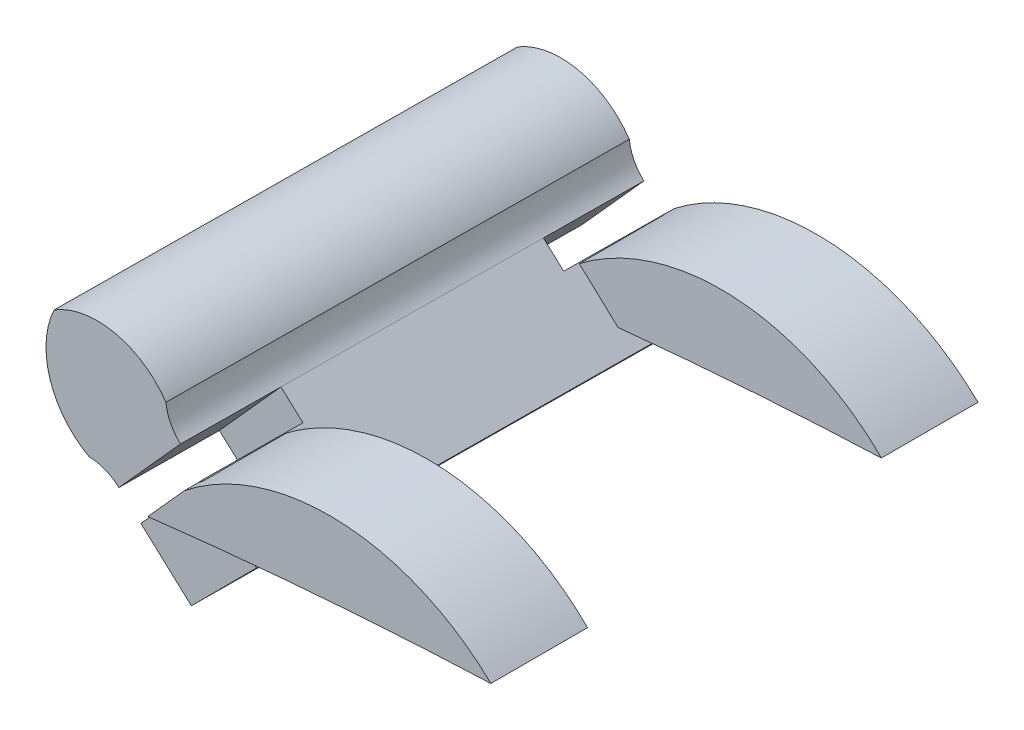
ISO-10303-21;
HEADER;
FILE_DESCRIPTION(('STEP AP214'),'2;1');
FILE_NAME('part.step','',(''),(''),'','','');
FILE_SCHEMA(('AUTOMOTIVE_DESIGN { 1 0 10303 214 1 1 1 1 }'));
ENDSEC;
DATA;
#1=APPLICATION_CONTEXT('core data for automotive mechanical design processes');
#2=APPLICATION_PROTOCOL_DEFINITION('international standard','automotive_design',2000,#1);
#3=PRODUCT_CONTEXT('',#1,'mechanical');
#4=PRODUCT('Part','Part','',(#3));
#5=PRODUCT_RELATED_PRODUCT_CATEGORY('part','',(#4));
#6=PRODUCT_DEFINITION_FORMATION('','',#4);
#7=PRODUCT_DEFINITION_CONTEXT('part definition',#1,'design');
#8=PRODUCT_DEFINITION('design','',#6,#7);
#9=PRODUCT_DEFINITION_SHAPE('','',#8);
#10=(LENGTH_UNIT() NAMED_UNIT(*) SI_UNIT(.MILLI.,.METRE.));
#11=(NAMED_UNIT(*) PLANE_ANGLE_UNIT() SI_UNIT($,.RADIAN.));
#12=(NAMED_UNIT(*) SI_UNIT($,.STERADIAN.) SOLID_ANGLE_UNIT());
#13=UNCERTAINTY_MEASURE_WITH_UNIT(LENGTH_MEASURE(1.E-05),#10,'distance_accuracy_value','');
#14=(GEOMETRIC_REPRESENTATION_CONTEXT(3) GLOBAL_UNCERTAINTY_ASSIGNED_CONTEXT((#13)) GLOBAL_UNIT_ASSIGNED_CONTEXT((#10,
#11,#12)) REPRESENTATION_CONTEXT('',''));
#15=CARTESIAN_POINT('',(0.,0.,0.));
#16=DIRECTION('',(0.,0.,1.));
#17=DIRECTION('',(1.,0.,0.));
#18=AXIS2_PLACEMENT_3D('',#15,#16,#17);
#19=CARTESIAN_POINT('',(49.7,35.27415884797,-4.10000922102E-11));
#20=DIRECTION('',(0.,0.,1.));
#21=DIRECTION('',(1.,0.,0.));
#22=AXIS2_PLACEMENT_3D('',#19,#20,#21);
#23=PLANE('',#22);
#24=CARTESIAN_POINT('',(46.2,61.50000005729,-4.09984546312359E-11));
#25=DIRECTION('',(0.,0.,1.));
#26=DIRECTION('',(1.,0.,0.));
#27=AXIS2_PLACEMENT_3D('',#24,#25,#26);
#28=CIRCLE('',#27,8.353678911594);
#29=CARTESIAN_POINT('',(40.9719558750908,68.0154820798278,-4.09764453271344E-11));
#30=VERTEX_POINT('',#29);
#31=CARTESIAN_POINT('',(51.9864069912262,67.5250681473659,-3.8772584258024E-11));
#32=VERTEX_POINT('',#31);
#33=EDGE_CURVE('E261',#30,#32,#28,.F.);
#34=ORIENTED_EDGE('',*,*,#33,.F.);
#35=DIRECTION('',(0.668223170633966,0.743960882189306,0.));
#36=VECTOR('',#35,1.);
#37=CARTESIAN_POINT('',(41.1208687099459,68.1812729845103,-4.09544360230329E-11));
#38=LINE('',#37,#36);
#39=CARTESIAN_POINT('',(39.6614822989728,66.5564768842461,-3.86675283806093E-11));
#40=VERTEX_POINT('',#39);
#41=EDGE_CURVE('E273',#30,#40,#38,.F.);
#42=ORIENTED_EDGE('',*,*,#41,.T.);
#43=CARTESIAN_POINT('',(58.3500167317,-92.34833312181,-3.63806207381856E-11));
#44=DIRECTION('',(0.,0.,1.));
#45=DIRECTION('',(1.,0.,0.));
#46=AXIS2_PLACEMENT_3D('',#43,#44,#45);
#47=CIRCLE('',#46,159.9999998822);
#48=EDGE_CURVE('E257',#40,#32,#47,.F.);
#49=ORIENTED_EDGE('',*,*,#48,.T.);
#50=EDGE_LOOP('',(#34,#42,#49));
#51=FACE_BOUND('',#50,.T.);
#52=ADVANCED_FACE('F16',(#51),#23,.T.);
#53=CARTESIAN_POINT('',(37.51144132404,69.20145831981,-0.5187039433837));
#54=DIRECTION('',(-0.00295958513391493,0.00557452525148287,0.999980082563676));
#55=DIRECTION('',(0.,-0.999984462077299,0.00557454966567842));
#56=AXIS2_PLACEMENT_3D('',#53,#54,#55);
#57=PLANE('',#56);
#58=CARTESIAN_POINT('',(58.3500167317,-92.34833312181,0.443552152042385));
#59=DIRECTION('',(-0.00295958513391493,0.00557452525148287,0.999980082563676));
#60=DIRECTION('',(0.468913388580543,-0.883221602732841,0.00631145592904762));
#61=AXIS2_PLACEMENT_3D('',#58,#59,#60);
#62=ELLIPSE('',#61,160.003186735483,159.9999998822);
#63=CARTESIAN_POINT('',(42.5741300393661,66.8720216114032,-0.490734424290321));
#64=VERTEX_POINT('',#63);
#65=CARTESIAN_POINT('',(39.6659145966319,66.5569980968447,-0.497585565399923));
#66=VERTEX_POINT('',#65);
#67=EDGE_CURVE('E195',#64,#66,#62,.T.);
#68=ORIENTED_EDGE('',*,*,#67,.T.);
#69=DIRECTION('',(-0.668231164335876,-0.743950538787235,0.00216952725328438));
#70=VECTOR('',#69,1.);
#71=CARTESIAN_POINT('',(39.6659145970363,66.5569980968643,-0.49758556539745));
#72=LINE('',#71,#70);
#73=CARTESIAN_POINT('',(38.9159635998299,65.7220677939799,-0.495150720670199));
#74=VERTEX_POINT('',#73);
#75=EDGE_CURVE('E416',#66,#74,#72,.T.);
#76=ORIENTED_EDGE('',*,*,#75,.T.);
#77=DIRECTION('',(-0.743947815282822,0.668211433985146,-0.00592685645437867));
#78=VECTOR('',#77,1.);
#79=CARTESIAN_POINT('',(40.743883799446,64.0802359978455,-0.480588112365385));
#80=LINE('',#79,#78);
#81=CARTESIAN_POINT('',(40.7438837994466,64.080235997845,-0.48058811236538));
#82=VERTEX_POINT('',#81);
#83=EDGE_CURVE('E190',#82,#74,#80,.T.);
#84=ORIENTED_EDGE('',*,*,#83,.F.);
#85=DIRECTION('',(-0.706250597059794,-0.707959496056707,0.00185636629396158));
#86=VECTOR('',#85,1.);
#87=CARTESIAN_POINT('',(43.0777091963512,66.4197085005988,-0.48672252813909));
#88=LINE('',#87,#86);
#89=CARTESIAN_POINT('',(43.0777091963491,66.4197085005982,-0.486722528139106));
#90=VERTEX_POINT('',#89);
#91=EDGE_CURVE('E187',#90,#82,#88,.T.);
#92=ORIENTED_EDGE('',*,*,#91,.F.);
#93=DIRECTION('',(-0.743947815290676,0.668211433976401,-0.00592685645435976));
#94=VECTOR('',#93,1.);
#95=CARTESIAN_POINT('',(43.07770919635,66.4197085006,-0.486722528139127));
#96=LINE('',#95,#94);
#97=EDGE_CURVE('E173',#90,#64,#96,.T.);
#98=ORIENTED_EDGE('',*,*,#97,.T.);
#99=EDGE_LOOP('',(#68,#76,#84,#92,#98));
#100=FACE_BOUND('',#99,.T.);
#101=ADVANCED_FACE('F188',(#100),#57,.T.);
#102=CARTESIAN_POINT('',(0.04985109407037,-0.09389700587586,-16.84361115115));
#103=DIRECTION('',(0.00295958513391493,-0.00557452525148286,-0.999980082563676));
#104=DIRECTION('',(0.,0.999984462077299,-0.00557454966567841));
#105=AXIS2_PLACEMENT_3D('',#102,#103,#104);
#106=PLANE('',#105);
#107=DIRECTION('',(0.743947815282821,-0.668211433985151,0.00592685645390303));
#108=VECTOR('',#107,1.);
#109=CARTESIAN_POINT('',(38.9055768878271,65.6829875895268,-17.09529423974));
#110=LINE('',#109,#108);
#111=CARTESIAN_POINT('',(38.9055768878314,65.6829875895268,-17.095294239742));
#112=VERTEX_POINT('',#111);
#113=CARTESIAN_POINT('',(40.7930129126705,63.9876988786695,-17.0802574829206));
#114=VERTEX_POINT('',#113);
#115=EDGE_CURVE('E426',#112,#114,#110,.T.);
#116=ORIENTED_EDGE('',*,*,#115,.F.);
#117=DIRECTION('',(0.668231164335149,0.743950538787881,-0.00216952725576038));
#118=VECTOR('',#117,1.);
#119=CARTESIAN_POINT('',(38.90557688783,65.68298758953,-17.0952942397462));
#120=LINE('',#119,#118);
#121=CARTESIAN_POINT('',(39.6935466075887,66.560244635364,-17.097852518786));
#122=VERTEX_POINT('',#121);
#123=EDGE_CURVE('E428',#112,#122,#120,.T.);
#124=ORIENTED_EDGE('',*,*,#123,.T.);
#125=CARTESIAN_POINT('',(58.3500167317,-92.34833312181,-16.1567784839886));
#126=DIRECTION('',(0.00295958513391493,-0.00557452525148286,-0.999980082563676));
#127=DIRECTION('',(0.468913388580543,-0.883221602732841,0.00631145592904762));
#128=AXIS2_PLACEMENT_3D('',#125,#126,#127);
#129=ELLIPSE('',#128,160.003186735483,159.9999998822);
#130=CARTESIAN_POINT('',(42.5255959213381,66.867205279179,-17.0911818547361));
#131=VERTEX_POINT('',#130);
#132=EDGE_CURVE('E251',#122,#131,#129,.T.);
#133=ORIENTED_EDGE('',*,*,#132,.T.);
#134=DIRECTION('',(0.743947815279004,-0.668211433989397,0.00592685645440019));
#135=VECTOR('',#134,1.);
#136=CARTESIAN_POINT('',(42.52559592135,66.86720527917,-17.0911818547361));
#137=LINE('',#136,#135);
#138=CARTESIAN_POINT('',(43.1268383095701,66.3271713814201,-17.0863918986993));
#139=VERTEX_POINT('',#138);
#140=EDGE_CURVE('E167',#131,#139,#137,.T.);
#141=ORIENTED_EDGE('',*,*,#140,.T.);
#142=DIRECTION('',(0.706250597059797,0.7079594960567,-0.0018563662958682));
#143=VECTOR('',#142,1.);
#144=CARTESIAN_POINT('',(40.7930129126711,63.987698878669,-17.08025748292));
#145=LINE('',#144,#143);
#146=EDGE_CURVE('E198',#114,#139,#145,.T.);
#147=ORIENTED_EDGE('',*,*,#146,.F.);
#148=EDGE_LOOP('',(#116,#124,#133,#141,#147));
#149=FACE_BOUND('',#148,.T.);
#150=ADVANCED_FACE('F306',(#149),#106,.T.);
#151=CARTESIAN_POINT('',(0.,0.,-17.50000000004));
#152=DIRECTION('',(0.,0.,-1.));
#153=DIRECTION('',(-1.,0.,0.));
#154=AXIS2_PLACEMENT_3D('',#151,#152,#153);
#155=PLANE('',#154);
#156=CARTESIAN_POINT('',(58.3500167317,-92.34833312181,-17.50000000004));
#157=DIRECTION('',(0.,0.,1.));
#158=DIRECTION('',(1.,0.,0.));
#159=AXIS2_PLACEMENT_3D('',#156,#157,#158);
#160=CIRCLE('',#159,159.9999998822);
#161=CARTESIAN_POINT('',(51.9864069912267,67.5250681473527,-17.50000000004));
#162=VERTEX_POINT('',#161);
#163=CARTESIAN_POINT('',(39.6971280538405,66.5606650698306,-17.50000000004));
#164=VERTEX_POINT('',#163);
#165=EDGE_CURVE('E249',#162,#164,#160,.T.);
#166=ORIENTED_EDGE('',*,*,#165,.T.);
#167=DIRECTION('',(0.668223170633966,0.743960882189306,0.));
#168=VECTOR('',#167,1.);
#169=CARTESIAN_POINT('',(41.1177117953848,68.1422605307908,-17.50000000004));
#170=LINE('',#169,#168);
#171=CARTESIAN_POINT('',(41.0813296543652,68.1017547672699,-17.50000000004));
#172=VERTEX_POINT('',#171);
#173=EDGE_CURVE('E240',#164,#172,#170,.T.);
#174=ORIENTED_EDGE('',*,*,#173,.T.);
#175=CARTESIAN_POINT('',(46.2,61.50000005729,-17.50000000004));
#176=DIRECTION('',(0.,0.,1.));
#177=DIRECTION('',(1.,0.,0.));
#178=AXIS2_PLACEMENT_3D('',#175,#176,#177);
#179=CIRCLE('',#178,8.353678911594);
#180=EDGE_CURVE('E241',#162,#172,#179,.T.);
#181=ORIENTED_EDGE('',*,*,#180,.F.);
#182=EDGE_LOOP('',(#166,#174,#181));
#183=FACE_BOUND('',#182,.T.);
#184=ADVANCED_FACE('F302',(#183),#155,.T.);
#185=CARTESIAN_POINT('',(40.79301291267,63.98769887867,-17.08025748292));
#186=DIRECTION('',(-0.668231164337429,-0.743950538785832,0.00216952725574509));
#187=DIRECTION('',(0.743952289623257,-0.668232736974412,0.));
#188=AXIS2_PLACEMENT_3D('',#185,#186,#187);
#189=PLANE('',#188);
#190=DIRECTION('',(0.00295958513439648,-0.0055745252509481,-0.999980082563677));
#191=VECTOR('',#190,1.);
#192=CARTESIAN_POINT('',(38.91596359983,65.72206779398,-0.495150720670201));
#193=LINE('',#192,#191);
#194=CARTESIAN_POINT('',(38.9266181063125,65.7019995030777,-4.09507901789898));
#195=VERTEX_POINT('',#194);
#196=EDGE_CURVE('E275',#74,#195,#193,.T.);
#197=ORIENTED_EDGE('',*,*,#196,.T.);
#198=DIRECTION('',(-0.743947815287817,0.668211433979585,-0.00592685645436911));
#199=VECTOR('',#198,1.);
#200=CARTESIAN_POINT('',(38.92661810631,65.70199950308,-4.09507901789899));
#201=LINE('',#200,#199);
#202=CARTESIAN_POINT('',(38.1305939439536,66.4169857374386,-4.10142075430578));
#203=VERTEX_POINT('',#202);
#204=EDGE_CURVE('E412',#195,#203,#201,.T.);
#205=ORIENTED_EDGE('',*,*,#204,.T.);
#206=DIRECTION('',(-0.00295958513391512,0.00557452525148287,0.999980082563676));
#207=VECTOR('',#206,1.);
#208=CARTESIAN_POINT('',(38.1690685506945,66.3445169091747,-17.1011618276296));
#209=LINE('',#208,#207);
#210=CARTESIAN_POINT('',(38.1584140442147,66.3645852000763,-13.5012335304015));
#211=VERTEX_POINT('',#210);
#212=EDGE_CURVE('E236',#203,#211,#209,.F.);
#213=ORIENTED_EDGE('',*,*,#212,.T.);
#214=DIRECTION('',(0.743947815284975,-0.668211433982749,0.00592685645437895));
#215=VECTOR('',#214,1.);
#216=CARTESIAN_POINT('',(38.15841404421,66.36458520008,-13.501233530406));
#217=LINE('',#216,#215);
#218=CARTESIAN_POINT('',(38.8949223813499,65.70305588043,-13.4953659425161));
#219=VERTEX_POINT('',#218);
#220=EDGE_CURVE('E436',#211,#219,#217,.T.);
#221=ORIENTED_EDGE('',*,*,#220,.T.);
#222=DIRECTION('',(0.00295958513439549,-0.0055745252509501,-0.999980082563677));
#223=VECTOR('',#222,1.);
#224=CARTESIAN_POINT('',(38.8949223813498,65.7030558804302,-13.49536594251));
#225=LINE('',#224,#223);
#226=EDGE_CURVE('E419',#219,#112,#225,.T.);
#227=ORIENTED_EDGE('',*,*,#226,.T.);
#228=ORIENTED_EDGE('',*,*,#115,.T.);
#229=DIRECTION('',(0.00295958513366292,-0.00557452525173631,-0.999980082563675));
#230=VECTOR('',#229,1.);
#231=CARTESIAN_POINT('',(40.7438837994523,64.0802359978478,-0.480588112365381));
#232=LINE('',#231,#230);
#233=EDGE_CURVE('E194',#82,#114,#232,.T.);
#234=ORIENTED_EDGE('',*,*,#233,.F.);
#235=ORIENTED_EDGE('',*,*,#83,.T.);
#236=EDGE_LOOP('',(#197,#205,#213,#221,#227,#228,#234,#235));
#237=FACE_BOUND('',#236,.T.);
#238=ADVANCED_FACE('F298',(#237),#189,.T.);
#239=CARTESIAN_POINT('',(41.13178094862,68.15703628108,-4.102238457843));
#240=DIRECTION('',(0.00295958513391493,-0.00557452525148286,-0.999980082563676));
#241=DIRECTION('',(0.,0.999984462077299,-0.00557454966567841));
#242=AXIS2_PLACEMENT_3D('',#239,#240,#241);
#243=PLANE('',#242);
#244=ORIENTED_EDGE('',*,*,#204,.F.);
#245=DIRECTION('',(0.668231164335885,0.74395053878722,-0.00216952725575535));
#246=VECTOR('',#245,1.);
#247=CARTESIAN_POINT('',(38.9266181063138,65.7019995030766,-4.09507901789897));
#248=LINE('',#247,#246);
#249=CARTESIAN_POINT('',(41.1317809486209,68.1570362810783,-4.10223845784299));
#250=VERTEX_POINT('',#249);
#251=EDGE_CURVE('E405',#195,#250,#248,.T.);
#252=ORIENTED_EDGE('',*,*,#251,.T.);
#253=DIRECTION('',(0.743947815283635,-0.668211433984241,0.00592685645438273));
#254=VECTOR('',#253,1.);
#255=CARTESIAN_POINT('',(40.33575678627,68.87202251544,-4.10858019424916));
#256=LINE('',#255,#254);
#257=CARTESIAN_POINT('',(40.3357567862711,68.8720225154394,-4.10858019424978));
#258=VERTEX_POINT('',#257);
#259=EDGE_CURVE('E410',#258,#250,#256,.T.);
#260=ORIENTED_EDGE('',*,*,#259,.F.);
#261=DIRECTION('',(-0.668231164335884,-0.743950538787221,0.00216952725576434));
#262=VECTOR('',#261,1.);
#263=CARTESIAN_POINT('',(40.33575678627,68.87202251544,-4.10858019425));
#264=LINE('',#263,#262);
#265=EDGE_CURVE('E233',#258,#203,#264,.T.);
#266=ORIENTED_EDGE('',*,*,#265,.T.);
#267=EDGE_LOOP('',(#244,#252,#260,#266));
#268=FACE_BOUND('',#267,.T.);
#269=ADVANCED_FACE('F295',(#268),#243,.F.);
#270=CARTESIAN_POINT('',(41.11713100221,68.18463018107,0.8476629508467));
#271=DIRECTION('',(0.743947815284206,-0.668211433983605,0.00592685645438105));
#272=DIRECTION('',(0.668223170633966,0.743960882189306,0.));
#273=AXIS2_PLACEMENT_3D('',#270,#271,#272);
#274=PLANE('',#273);
#275=CARTESIAN_POINT('',(40.9861900524217,68.0268781156379,-0.5018720664473));
#276=CARTESIAN_POINT('',(40.98559644371,68.0264039282886,-0.480960730347062));
#277=CARTESIAN_POINT('',(40.9850028996882,68.0259296599577,-0.460049394246824));
#278=CARTESIAN_POINT('',(40.9838159410683,68.024980961368,-0.41822672204635));
#279=CARTESIAN_POINT('',(40.9832225264703,68.0245065311092,-0.397315385946114));
#280=CARTESIAN_POINT('',(40.9820358267423,68.0235575086991,-0.35549271374564));
#281=CARTESIAN_POINT('',(40.9814425416123,68.0230829165477,-0.334581377645403));
#282=CARTESIAN_POINT('',(40.9802561008646,68.0221335703878,-0.292758705444928));
#283=CARTESIAN_POINT('',(40.9796629452468,68.0216588163792,-0.27184736934469));
#284=CARTESIAN_POINT('',(40.9784767635675,68.0207091465403,-0.230024697144216));
#285=CARTESIAN_POINT('',(40.977883737506,68.0202342307098,-0.20911336104398));
#286=CARTESIAN_POINT('',(40.9766978149836,68.0192842372624,-0.167290688843506));
#287=CARTESIAN_POINT('',(40.9761049185226,68.0188091596454,-0.146379352743268));
#288=CARTESIAN_POINT('',(40.9749192552453,68.0178588426603,-0.104556680542794));
#289=CARTESIAN_POINT('',(40.974326488429,68.0173836032922,-0.0836453444425581));
#290=CARTESIAN_POINT('',(40.973141084485,68.0164329628402,-0.0418226722420842));
#291=CARTESIAN_POINT('',(40.9725484473574,68.0159575617563,-0.0209113361418468));
#292=CARTESIAN_POINT('',(40.9719558750963,68.0154820798322,-4.16090772947797E-11));
#293=B_SPLINE_CURVE_WITH_KNOTS('',3,(#275,#276,#277,#278,#279,#280,#281,#282,#283,#284,#285,
#286,#287,#288,#289,#290,#291,#292),.UNSPECIFIED.,.F.,.F.,(4,2,2,2,2,2,2,2,4),(0.,
0.0627753998150959,0.125550799630189,0.188326199445284,0.25110159926038,0.313876999075473,
0.376652398890568,0.439427798705661,0.502203198520757),.UNSPECIFIED.);
#294=CARTESIAN_POINT('',(40.9861900524154,68.0268781156329,-0.501872066447243));
#295=VERTEX_POINT('',#294);
#296=EDGE_CURVE('E263',#295,#30,#293,.T.);
#297=ORIENTED_EDGE('',*,*,#296,.F.);
#298=DIRECTION('',(-0.668231164336186,-0.743950538786949,0.00216952725575523));
#299=VECTOR('',#298,1.);
#300=CARTESIAN_POINT('',(41.12112644214,68.17710457198,-0.502310160614203));
#301=LINE('',#300,#299);
#302=CARTESIAN_POINT('',(41.121126442141,68.1771045719812,-0.502310160614204));
#303=VERTEX_POINT('',#302);
#304=EDGE_CURVE('E141',#303,#295,#301,.T.);
#305=ORIENTED_EDGE('',*,*,#304,.F.);
#306=DIRECTION('',(-0.00295958513285643,0.00557452525053563,0.999980082563684));
#307=VECTOR('',#306,1.);
#308=CARTESIAN_POINT('',(41.1317809486193,68.1570362810792,-4.10223845784299));
#309=LINE('',#308,#307);
#310=EDGE_CURVE('E394',#250,#303,#309,.T.);
#311=ORIENTED_EDGE('',*,*,#310,.F.);
#312=ORIENTED_EDGE('',*,*,#251,.F.);
#313=ORIENTED_EDGE('',*,*,#196,.F.);
#314=ORIENTED_EDGE('',*,*,#75,.F.);
#315=CARTESIAN_POINT('',(39.6659145970275,66.5569980968912,-0.497585565397501));
#316=CARTESIAN_POINT('',(39.6657299176384,66.5569763822732,-0.476852833507455));
#317=CARTESIAN_POINT('',(39.6655452382871,66.5569546673332,-0.456120101617409));
#318=CARTESIAN_POINT('',(39.6651758796603,66.5569112368094,-0.414654637837315));
#319=CARTESIAN_POINT('',(39.6649912003847,66.5568895212255,-0.393921905947267));
#320=CARTESIAN_POINT('',(39.6646218419093,66.5568460894138,-0.352456442167173));
#321=CARTESIAN_POINT('',(39.6644371627094,66.5568243731861,-0.331723710277127));
#322=CARTESIAN_POINT('',(39.6640678043855,66.5567809400866,-0.290258246497034));
#323=CARTESIAN_POINT('',(39.6638831252613,66.556759223215,-0.269525514606987));
#324=CARTESIAN_POINT('',(39.6635137670888,66.5567157888277,-0.228060050826895));
#325=CARTESIAN_POINT('',(39.6633290880404,66.5566940713121,-0.207327318936848));
#326=CARTESIAN_POINT('',(39.6629597300193,66.5566506356371,-0.165861855156755));
#327=CARTESIAN_POINT('',(39.6627750510466,66.5566289174776,-0.145129123266709));
#328=CARTESIAN_POINT('',(39.6624056931769,66.5565854805147,-0.103663659486615));
#329=CARTESIAN_POINT('',(39.6622210142799,66.5565637617114,-0.0829309275965675));
#330=CARTESIAN_POINT('',(39.6618516565618,66.5565203234607,-0.0414654638164734));
#331=CARTESIAN_POINT('',(39.6616669777405,66.5564986040135,-0.0207327319264269));
#332=CARTESIAN_POINT('',(39.6614822989571,66.5564768842442,-3.63806207381856E-11));
#333=B_SPLINE_CURVE_WITH_KNOTS('',3,(#315,#316,#317,#318,#319,#320,#321,#322,#323,#324,#325,
#326,#327,#328,#329,#330,#331,#332),.UNSPECIFIED.,.F.,.F.,(4,2,2,2,2,2,2,2,4),(0.,
0.0622006973162967,0.124401394632597,0.186602091948894,0.24880278926519,0.311003486581487,
0.373204183897785,0.435404881214085,0.497605578530381),.UNSPECIFIED.);
#334=EDGE_CURVE('E259',#66,#40,#333,.T.);
#335=ORIENTED_EDGE('',*,*,#334,.T.);
#336=ORIENTED_EDGE('',*,*,#41,.F.);
#337=EDGE_LOOP('',(#297,#305,#311,#312,#313,#314,#335,#336));
#338=FACE_BOUND('',#337,.T.);
#339=ADVANCED_FACE('F292',(#338),#274,.F.);
#340=CARTESIAN_POINT('',(37.51144132404,69.20145831981,-0.5187039433837));
#341=DIRECTION('',(-0.00295958513391493,0.00557452525148287,0.999980082563676));
#342=DIRECTION('',(0.,-0.999984462077299,0.00557454966567842));
#343=AXIS2_PLACEMENT_3D('',#340,#341,#342);
#344=PLANE('',#343);
#345=DIRECTION('',(0.743947815284177,-0.66821143398372,0.00592685644512403));
#346=VECTOR('',#345,1.);
#347=CARTESIAN_POINT('',(41.121126442141,68.1771045719812,-0.502310160614201));
#348=LINE('',#347,#346);
#349=CARTESIAN_POINT('',(41.1480326249479,68.1529375287733,-0.502095805413869));
#350=VERTEX_POINT('',#349);
#351=EDGE_CURVE('E391',#303,#350,#348,.T.);
#352=ORIENTED_EDGE('',*,*,#351,.F.);
#353=ORIENTED_EDGE('',*,*,#304,.T.);
#354=CARTESIAN_POINT('',(46.2,61.50000005729,-0.450056073443943));
#355=DIRECTION('',(-0.00295958513391493,0.00557452525148287,0.999980082563676));
#356=DIRECTION('',(0.468913388580543,-0.883221602732841,0.00631145592904762));
#357=AXIS2_PLACEMENT_3D('',#354,#355,#356);
#358=ELLIPSE('',#357,8.3538452987758,8.353678911594);
#359=EDGE_CURVE('E19',#350,#295,#358,.T.);
#360=ORIENTED_EDGE('',*,*,#359,.F.);
#361=EDGE_LOOP('',(#352,#353,#360));
#362=FACE_BOUND('',#361,.T.);
#363=ADVANCED_FACE('F288',(#362),#344,.T.);
#364=CARTESIAN_POINT('',(46.2,61.50000005729,-17.50000000004));
#365=DIRECTION('',(0.,0.,1.));
#366=DIRECTION('',(1.,0.,0.));
#367=AXIS2_PLACEMENT_3D('',#364,#365,#366);
#368=CYLINDRICAL_SURFACE('',#367,8.353678911594);
#369=ORIENTED_EDGE('',*,*,#296,.T.);
#370=ORIENTED_EDGE('',*,*,#33,.T.);
#371=DIRECTION('',(0.,0.,1.));
#372=VECTOR('',#371,1.);
#373=CARTESIAN_POINT('',(51.986406991239,67.5250681473665,-17.50000000004));
#374=LINE('',#373,#372);
#375=CARTESIAN_POINT('',(51.9864069912263,67.5250681473659,-3.47236209997314));
#376=VERTEX_POINT('',#375);
#377=EDGE_CURVE('E256',#32,#376,#374,.F.);
#378=ORIENTED_EDGE('',*,*,#377,.T.);
#379=CARTESIAN_POINT('',(46.2,61.50000005729,-3.36719414526751));
#380=DIRECTION('',(0.,0.01745240643669,0.999847695156402));
#381=DIRECTION('',(0.,-0.999847695156402,0.01745240643669));
#382=AXIS2_PLACEMENT_3D('',#379,#380,#381);
#383=ELLIPSE('',#382,8.35495141116195,8.353678911594);
#384=CARTESIAN_POINT('',(41.1427897587915,68.1489530526302,-3.48325205150099));
#385=VERTEX_POINT('',#384);
#386=EDGE_CURVE('E260',#376,#385,#383,.T.);
#387=ORIENTED_EDGE('',*,*,#386,.T.);
#388=DIRECTION('',(-0.00175866440114728,-0.00133655068530088,-0.999997560362919));
#389=VECTOR('',#388,1.);
#390=CARTESIAN_POINT('',(41.1480326249457,68.1529375287752,-0.502095805413886));
#391=LINE('',#390,#389);
#392=EDGE_CURVE('E387',#350,#385,#391,.T.);
#393=ORIENTED_EDGE('',*,*,#392,.F.);
#394=ORIENTED_EDGE('',*,*,#359,.T.);
#395=EDGE_LOOP('',(#369,#370,#378,#387,#393,#394));
#396=FACE_BOUND('',#395,.T.);
#397=ADVANCED_FACE('F277',(#396),#368,.T.);
#398=CARTESIAN_POINT('',(39.04910432464,40.69131666049,-3.003977225518));
#399=DIRECTION('',(0.,0.01745240643669,0.999847695156402));
#400=DIRECTION('',(0.,-0.999847695156402,0.01745240643669));
#401=AXIS2_PLACEMENT_3D('',#398,#399,#400);
#402=PLANE('',#401);
#403=CARTESIAN_POINT('',(58.3500167317,-92.34833312181,-0.681761500619618));
#404=DIRECTION('',(0.,0.01745240643669,0.999847695156402));
#405=DIRECTION('',(0.,-0.999847695156402,0.01745240643669));
#406=AXIS2_PLACEMENT_3D('',#403,#404,#405);
#407=ELLIPSE('',#406,160.024372369206,159.9999998822);
#408=CARTESIAN_POINT('',(42.5654450344582,66.8711608437041,-3.46094810553122));
#409=VERTEX_POINT('',#408);
#410=EDGE_CURVE('E254',#376,#409,#407,.T.);
#411=ORIENTED_EDGE('',*,*,#410,.T.);
#412=DIRECTION('',(0.743918598412862,-0.668168463144887,0.0116629239062376));
#413=VECTOR('',#412,1.);
#414=CARTESIAN_POINT('',(41.1427897587908,68.1489530526309,-3.483252051501));
#415=LINE('',#414,#413);
#416=EDGE_CURVE('E204',#385,#409,#415,.T.);
#417=ORIENTED_EDGE('',*,*,#416,.F.);
#418=ORIENTED_EDGE('',*,*,#386,.F.);
#419=EDGE_LOOP('',(#411,#417,#418));
#420=FACE_BOUND('',#419,.T.);
#421=ADVANCED_FACE('F287',(#420),#402,.F.);
#422=CARTESIAN_POINT('',(58.3500167317,-92.34833312181,-17.50000000004));
#423=DIRECTION('',(0.,0.,1.));
#424=DIRECTION('',(1.,0.,0.));
#425=AXIS2_PLACEMENT_3D('',#422,#423,#424);
#426=CYLINDRICAL_SURFACE('',#425,159.9999998822);
#427=DIRECTION('',(0.002924021080285,0.000289798673099883,0.999995683049407));
#428=VECTOR('',#427,1.);
#429=CARTESIAN_POINT('',(42.5654450344718,66.871160843692,-3.460948105516));
#430=LINE('',#429,#428);
#431=EDGE_CURVE('E181',#409,#64,#430,.T.);
#432=ORIENTED_EDGE('',*,*,#431,.F.);
#433=ORIENTED_EDGE('',*,*,#410,.F.);
#434=ORIENTED_EDGE('',*,*,#377,.F.);
#435=ORIENTED_EDGE('',*,*,#48,.F.);
#436=ORIENTED_EDGE('',*,*,#334,.F.);
#437=ORIENTED_EDGE('',*,*,#67,.F.);
#438=EDGE_LOOP('',(#432,#433,#434,#435,#436,#437));
#439=FACE_BOUND('',#438,.T.);
#440=ADVANCED_FACE('F448',(#439),#426,.F.);
#441=CARTESIAN_POINT('',(43.12683830957,66.32717138142,-17.0863918987));
#442=DIRECTION('',(0.707955743679309,-0.706231036284409,0.00603227818712808));
#443=DIRECTION('',(0.706243885936796,0.707968624712207,0.));
#444=AXIS2_PLACEMENT_3D('',#441,#442,#443);
#445=PLANE('',#444);
#446=ORIENTED_EDGE('',*,*,#233,.T.);
#447=ORIENTED_EDGE('',*,*,#146,.T.);
#448=DIRECTION('',(0.00295958513397572,-0.00557452525153773,-0.999980082563675));
#449=VECTOR('',#448,1.);
#450=CARTESIAN_POINT('',(43.077709196347,66.4197085005966,-0.486722528139086));
#451=LINE('',#450,#449);
#452=EDGE_CURVE('E178',#90,#139,#451,.T.);
#453=ORIENTED_EDGE('',*,*,#452,.F.);
#454=ORIENTED_EDGE('',*,*,#91,.T.);
#455=EDGE_LOOP('',(#446,#447,#453,#454));
#456=FACE_BOUND('',#455,.T.);
#457=ADVANCED_FACE('F197',(#456),#445,.T.);
#458=CARTESIAN_POINT('',(58.3500167317,-92.34833312181,-17.50000000004));
#459=DIRECTION('',(0.,0.,1.));
#460=DIRECTION('',(1.,0.,0.));
#461=AXIS2_PLACEMENT_3D('',#458,#459,#460);
#462=CYLINDRICAL_SURFACE('',#461,159.9999998822);
#463=DIRECTION('',(0.,0.,1.));
#464=VECTOR('',#463,1.);
#465=CARTESIAN_POINT('',(51.98640699124,67.52506814734,-17.50000000004));
#466=LINE('',#465,#464);
#467=CARTESIAN_POINT('',(51.9864069912395,67.5250681473532,-14.02969348663));
#468=VERTEX_POINT('',#467);
#469=EDGE_CURVE('E244',#468,#162,#466,.F.);
#470=ORIENTED_EDGE('',*,*,#469,.F.);
#471=CARTESIAN_POINT('',(42.5345790797371,66.8680978587294,-14.01822602759));
#472=CARTESIAN_POINT('',(42.9277153468179,66.9071492725742,-14.0189076677633));
#473=CARTESIAN_POINT('',(43.3209963008156,66.9447445396772,-14.0195638848228));
#474=CARTESIAN_POINT('',(44.1077584623674,67.0170146387771,-14.0208253382385));
#475=CARTESIAN_POINT('',(44.5012396239669,67.0516899709043,-14.0214305833251));
#476=CARTESIAN_POINT('',(45.2883804843133,67.1181197629246,-14.022590092797));
#477=CARTESIAN_POINT('',(45.6820401408228,67.1498747231463,-14.0231443659148));
#478=CARTESIAN_POINT('',(46.469516279359,67.2104635388224,-14.0242019314458));
#479=CARTESIAN_POINT('',(46.863332722866,67.2392978947687,-14.0247052325937));
#480=CARTESIAN_POINT('',(47.6511007347989,67.2940454183667,-14.025660854183));
#481=CARTESIAN_POINT('',(48.045052268422,67.3199590866483,-14.0261131833614));
#482=CARTESIAN_POINT('',(48.8330687706891,67.3688653186721,-14.0269668610091));
#483=CARTESIAN_POINT('',(49.2271337082466,67.3918583831533,-14.0273682182176));
#484=CARTESIAN_POINT('',(50.0153553414243,67.4349236399596,-14.0281199519244));
#485=CARTESIAN_POINT('',(50.4095120096733,67.4549963331073,-14.028470337164));
#486=CARTESIAN_POINT('',(51.1978954387375,67.4922212834076,-14.029120126927));
#487=CARTESIAN_POINT('',(51.592122175896,67.5093740414315,-14.0294195401937));
#488=CARTESIAN_POINT('',(51.986406991239,67.5250681473665,-14.02969348663));
#489=B_SPLINE_CURVE_WITH_KNOTS('',3,(#471,#472,#473,#474,#475,#476,#477,#478,#479,#480,#481,
#482,#483,#484,#485,#486,#487,#488),.UNSPECIFIED.,.F.,.F.,(4,2,2,2,2,2,2,2,4),(0.,
1.18521221332307,2.3702210073488,3.55502640172904,4.73962841612567,5.9240270702107,
7.10822238366643,8.292214376185,9.476003067469),.UNSPECIFIED.);
#490=CARTESIAN_POINT('',(42.5345790797403,66.8680978587167,-14.01822602759));
#491=VERTEX_POINT('',#490);
#492=EDGE_CURVE('E248',#468,#491,#489,.F.);
#493=ORIENTED_EDGE('',*,*,#492,.T.);
#494=DIRECTION('',(0.00292328303426323,0.000290461606445106,0.999995685014869));
#495=VECTOR('',#494,1.);
#496=CARTESIAN_POINT('',(42.5255959213468,66.8672052791664,-17.09118185474));
#497=LINE('',#496,#495);
#498=EDGE_CURVE('E199',#131,#491,#497,.T.);
#499=ORIENTED_EDGE('',*,*,#498,.F.);
#500=ORIENTED_EDGE('',*,*,#132,.F.);
#501=DIRECTION('',(0.00890544648820696,0.00104543148060944,-0.999959799239882));
#502=VECTOR('',#501,1.);
#503=CARTESIAN_POINT('',(39.6935466069744,66.560244635276,-17.09785251878));
#504=LINE('',#503,#502);
#505=EDGE_CURVE('E422',#122,#164,#504,.T.);
#506=ORIENTED_EDGE('',*,*,#505,.T.);
#507=ORIENTED_EDGE('',*,*,#165,.F.);
#508=EDGE_LOOP('',(#470,#493,#499,#500,#506,#507));
#509=FACE_BOUND('',#508,.T.);
#510=ADVANCED_FACE('F371',(#509),#462,.F.);
#511=CARTESIAN_POINT('',(52.3975813812,40.50709388454,-13.55809299166));
#512=DIRECTION('',(0.,-0.01745240643669,-0.999847695156402));
#513=DIRECTION('',(0.,0.999847695156402,-0.01745240643669));
#514=AXIS2_PLACEMENT_3D('',#511,#512,#513);
#515=PLANE('',#514);
#516=CARTESIAN_POINT('',(46.2,61.50000005729,-13.9245255319249));
#517=DIRECTION('',(0.,-0.01745240643669,-0.999847695156402));
#518=DIRECTION('',(0.,-0.999847695156402,0.01745240643669));
#519=AXIS2_PLACEMENT_3D('',#516,#517,#518);
#520=ELLIPSE('',#519,8.35495141116195,8.353678911594);
#521=CARTESIAN_POINT('',(41.1242549418551,68.1348145582991,-14.04033664982));
#522=VERTEX_POINT('',#521);
#523=EDGE_CURVE('E245',#522,#468,#520,.T.);
#524=ORIENTED_EDGE('',*,*,#523,.F.);
#525=DIRECTION('',(-0.743918598412876,0.66816846314492,-0.0116629239034107));
#526=VECTOR('',#525,1.);
#527=CARTESIAN_POINT('',(42.5345790797435,66.8680978587039,-14.01822602759));
#528=LINE('',#527,#526);
#529=EDGE_CURVE('E202',#491,#522,#528,.T.);
#530=ORIENTED_EDGE('',*,*,#529,.F.);
#531=ORIENTED_EDGE('',*,*,#492,.F.);
#532=EDGE_LOOP('',(#524,#530,#531));
#533=FACE_BOUND('',#532,.T.);
#534=ADVANCED_FACE('F367',(#533),#515,.F.);
#535=CARTESIAN_POINT('',(46.2,61.50000005729,-17.50000000004));
#536=DIRECTION('',(0.,0.,1.));
#537=DIRECTION('',(1.,0.,0.));
#538=AXIS2_PLACEMENT_3D('',#535,#536,#537);
#539=CYLINDRICAL_SURFACE('',#538,8.353678911594);
#540=ORIENTED_EDGE('',*,*,#469,.T.);
#541=ORIENTED_EDGE('',*,*,#180,.T.);
#542=DIRECTION('',(-0.0263269222434461,-0.020446063716606,0.999444271404706));
#543=VECTOR('',#542,1.);
#544=CARTESIAN_POINT('',(41.0813296543679,68.1017547672729,-17.5000000000399));
#545=LINE('',#544,#543);
#546=CARTESIAN_POINT('',(41.0708542526143,68.0936193411202,-17.1023241846331));
#547=VERTEX_POINT('',#546);
#548=EDGE_CURVE('E431',#172,#547,#545,.T.);
#549=ORIENTED_EDGE('',*,*,#548,.T.);
#550=CARTESIAN_POINT('',(46.2,61.50000005729,-17.0503867094749));
#551=DIRECTION('',(0.00295958513391493,-0.00557452525148286,-0.999980082563676));
#552=DIRECTION('',(0.468913388580543,-0.883221602732841,0.00631145592904762));
#553=AXIS2_PLACEMENT_3D('',#550,#551,#552);
#554=ELLIPSE('',#553,8.3538452987758,8.353678911594);
#555=CARTESIAN_POINT('',(41.118888183141,68.1307054543544,-17.1023887628902));
#556=VERTEX_POINT('',#555);
#557=EDGE_CURVE('E237',#556,#547,#554,.F.);
#558=ORIENTED_EDGE('',*,*,#557,.F.);
#559=DIRECTION('',(-0.00175266306413457,-0.00134194121518808,-0.999997563680011));
#560=VECTOR('',#559,1.);
#561=CARTESIAN_POINT('',(41.1242549418519,68.1348145583021,-14.04033664982));
#562=LINE('',#561,#560);
#563=EDGE_CURVE('E516',#522,#556,#562,.T.);
#564=ORIENTED_EDGE('',*,*,#563,.F.);
#565=ORIENTED_EDGE('',*,*,#523,.T.);
#566=EDGE_LOOP('',(#540,#541,#549,#558,#564,#565));
#567=FACE_BOUND('',#566,.T.);
#568=ADVANCED_FACE('F363',(#567),#539,.T.);
#569=CARTESIAN_POINT('',(0.04985109407037,-0.09389700587586,-16.84361115115));
#570=DIRECTION('',(0.00295958513391493,-0.00557452525148286,-0.999980082563676));
#571=DIRECTION('',(0.,0.999984462077299,-0.00557454966567841));
#572=AXIS2_PLACEMENT_3D('',#569,#570,#571);
#573=PLANE('',#572);
#574=ORIENTED_EDGE('',*,*,#557,.T.);
#575=DIRECTION('',(0.668231164336258,0.743950538786582,-0.0021695273594592));
#576=VECTOR('',#575,1.);
#577=CARTESIAN_POINT('',(41.0708542526172,68.0936193411235,-17.1023241846299));
#578=LINE('',#577,#576);
#579=CARTESIAN_POINT('',(41.1107397301395,68.1380243675269,-17.10245367969));
#580=VERTEX_POINT('',#579);
#581=EDGE_CURVE('E423',#547,#580,#578,.T.);
#582=ORIENTED_EDGE('',*,*,#581,.T.);
#583=DIRECTION('',(-0.7439478152844,0.668211433983081,-0.00592685648913624));
#584=VECTOR('',#583,1.);
#585=CARTESIAN_POINT('',(41.1188881831377,68.1307054543574,-17.10238876289));
#586=LINE('',#585,#584);
#587=EDGE_CURVE('E507',#556,#580,#586,.T.);
#588=ORIENTED_EDGE('',*,*,#587,.F.);
#589=EDGE_LOOP('',(#574,#582,#588));
#590=FACE_BOUND('',#589,.T.);
#591=ADVANCED_FACE('F359',(#590),#573,.T.);
#592=CARTESIAN_POINT('',(41.10008522366,68.15809265843,-13.50252538246));
#593=DIRECTION('',(0.743947815284206,-0.668211433983605,0.00592685645438105));
#594=DIRECTION('',(0.668223170633966,0.743960882189306,0.));
#595=AXIS2_PLACEMENT_3D('',#592,#593,#594);
#596=PLANE('',#595);
#597=ORIENTED_EDGE('',*,*,#123,.F.);
#598=ORIENTED_EDGE('',*,*,#226,.F.);
#599=DIRECTION('',(0.668231164335816,0.743950538787281,-0.00216952725575822));
#600=VECTOR('',#599,1.);
#601=CARTESIAN_POINT('',(38.89492238135,65.70305588043,-13.4953659425161));
#602=LINE('',#601,#600);
#603=CARTESIAN_POINT('',(41.1000852236599,68.1580926584299,-13.50252538246));
#604=VERTEX_POINT('',#603);
#605=EDGE_CURVE('E493',#219,#604,#602,.T.);
#606=ORIENTED_EDGE('',*,*,#605,.T.);
#607=DIRECTION('',(-0.00295958513285159,0.00557452525052991,0.999980082563684));
#608=VECTOR('',#607,1.);
#609=CARTESIAN_POINT('',(41.1107397301382,68.138024367528,-17.10245367969));
#610=LINE('',#609,#608);
#611=EDGE_CURVE('E503',#580,#604,#610,.T.);
#612=ORIENTED_EDGE('',*,*,#611,.F.);
#613=ORIENTED_EDGE('',*,*,#581,.F.);
#614=ORIENTED_EDGE('',*,*,#548,.F.);
#615=ORIENTED_EDGE('',*,*,#173,.F.);
#616=ORIENTED_EDGE('',*,*,#505,.F.);
#617=EDGE_LOOP('',(#597,#598,#606,#612,#613,#614,#615,#616));
#618=FACE_BOUND('',#617,.T.);
#619=ADVANCED_FACE('F355',(#618),#596,.F.);
#620=CARTESIAN_POINT('',(40.36357688653,68.81962197808,-13.50839297035));
#621=DIRECTION('',(-0.00295958513391493,0.00557452525148287,0.999980082563676));
#622=DIRECTION('',(0.,-0.999984462077299,0.00557454966567842));
#623=AXIS2_PLACEMENT_3D('',#620,#621,#622);
#624=PLANE('',#623);
#625=ORIENTED_EDGE('',*,*,#220,.F.);
#626=DIRECTION('',(0.668231164335891,0.743950538787209,-0.00216952725759962));
#627=VECTOR('',#626,1.);
#628=CARTESIAN_POINT('',(38.1584140442155,66.3645852000751,-13.5012335304));
#629=LINE('',#628,#627);
#630=CARTESIAN_POINT('',(40.3635768865292,68.8196219780754,-13.50839297035));
#631=VERTEX_POINT('',#630);
#632=EDGE_CURVE('E544',#211,#631,#629,.T.);
#633=ORIENTED_EDGE('',*,*,#632,.T.);
#634=DIRECTION('',(-0.743947815284195,0.668211433983617,-0.00592685645457025));
#635=VECTOR('',#634,1.);
#636=CARTESIAN_POINT('',(41.1000852236599,68.1580926584299,-13.50252538246));
#637=LINE('',#636,#635);
#638=EDGE_CURVE('E506',#604,#631,#637,.T.);
#639=ORIENTED_EDGE('',*,*,#638,.F.);
#640=ORIENTED_EDGE('',*,*,#605,.F.);
#641=EDGE_LOOP('',(#625,#633,#639,#640));
#642=FACE_BOUND('',#641,.T.);
#643=ADVANCED_FACE('F351',(#642),#624,.F.);
#644=CARTESIAN_POINT('',(37.07722655895,65.12895486813,-17.09761697506));
#645=DIRECTION('',(-0.00295958513391512,0.00557452525148287,0.999980082563676));
#646=DIRECTION('',(0.,-0.999984462077299,0.00557454966567841));
#647=AXIS2_PLACEMENT_3D('',#644,#645,#646);
#648=CYLINDRICAL_SURFACE('',#647,1.633928571433);
#649=DIRECTION('',(-0.00295958513391512,0.00557452525148287,0.999980082563676));
#650=VECTOR('',#649,1.);
#651=CARTESIAN_POINT('',(37.0902187148706,66.7628066121311,-17.1066866521167));
#652=LINE('',#651,#650);
#653=CARTESIAN_POINT('',(37.0902187148671,66.762806612133,-17.1066866521203));
#654=VERTEX_POINT('',#653);
#655=CARTESIAN_POINT('',(37.0410896016442,66.8553437313076,-0.507017281564202));
#656=VERTEX_POINT('',#655);
#657=EDGE_CURVE('E230',#654,#656,#652,.T.);
#658=ORIENTED_EDGE('',*,*,#657,.F.);
#659=CARTESIAN_POINT('',(37.07722655895,65.12895486813,-17.0976169750605));
#660=DIRECTION('',(-0.00295958513391512,0.00557452525148287,0.999980082563676));
#661=DIRECTION('',(0.,-0.999984462077299,0.00557454966567841));
#662=AXIS2_PLACEMENT_3D('',#659,#660,#661);
#663=CIRCLE('',#662,1.633928571433);
#664=CARTESIAN_POINT('',(38.1690685506997,66.3445169091702,-17.101161827633));
#665=VERTEX_POINT('',#664);
#666=EDGE_CURVE('E234',#665,#654,#663,.T.);
#667=ORIENTED_EDGE('',*,*,#666,.F.);
#668=DIRECTION('',(-0.00295958513425279,0.00557452525110802,0.999980082563677));
#669=VECTOR('',#668,1.);
#670=CARTESIAN_POINT('',(38.1690685506988,66.3445169091711,-17.10116182763));
#671=LINE('',#670,#669);
#672=EDGE_CURVE('E546',#665,#211,#671,.T.);
#673=ORIENTED_EDGE('',*,*,#672,.T.);
#674=ORIENTED_EDGE('',*,*,#212,.F.);
#675=DIRECTION('',(-0.00295958513300992,0.00557452525249261,0.999980082563673));
#676=VECTOR('',#675,1.);
#677=CARTESIAN_POINT('',(38.1305939439553,66.4169857374352,-4.10142075430596));
#678=LINE('',#677,#676);
#679=CARTESIAN_POINT('',(38.1199394374734,66.4370540283473,-0.501492457076425));
#680=VERTEX_POINT('',#679);
#681=EDGE_CURVE('E402',#203,#680,#678,.T.);
#682=ORIENTED_EDGE('',*,*,#681,.T.);
#683=CARTESIAN_POINT('',(37.028097445727,65.2214919873046,-0.49794760450687));
#684=DIRECTION('',(-0.00295958513391512,0.00557452525148287,0.999980082563676));
#685=DIRECTION('',(0.,-0.999984462077299,0.00557454966567841));
#686=AXIS2_PLACEMENT_3D('',#683,#684,#685);
#687=CIRCLE('',#686,1.633928571433);
#688=EDGE_CURVE('E231',#656,#680,#687,.F.);
#689=ORIENTED_EDGE('',*,*,#688,.F.);
#690=EDGE_LOOP('',(#658,#667,#673,#674,#682,#689));
#691=FACE_BOUND('',#690,.T.);
#692=ADVANCED_FACE('F347',(#691),#648,.F.);
#693=CARTESIAN_POINT('',(40.33575678627,68.87202251544,-4.10858019425));
#694=DIRECTION('',(-0.743947815284206,0.668211433983605,-0.00592685645438105));
#695=DIRECTION('',(-0.668223170633966,-0.743960882189306,0.));
#696=AXIS2_PLACEMENT_3D('',#693,#694,#695);
#697=PLANE('',#696);
#698=ORIENTED_EDGE('',*,*,#681,.F.);
#699=ORIENTED_EDGE('',*,*,#265,.F.);
#700=DIRECTION('',(-0.00295958513391512,0.00557452525148287,0.999980082563676));
#701=VECTOR('',#700,1.);
#702=CARTESIAN_POINT('',(40.3742313930112,68.799553687171,-17.1083212675804));
#703=LINE('',#702,#701);
#704=CARTESIAN_POINT('',(40.3251022797848,68.8920908063486,-0.508651897020373));
#705=VERTEX_POINT('',#704);
#706=EDGE_CURVE('E225',#258,#705,#703,.T.);
#707=ORIENTED_EDGE('',*,*,#706,.T.);
#708=DIRECTION('',(0.668231164335823,0.743950538787275,-0.00216952725575794));
#709=VECTOR('',#708,1.);
#710=CARTESIAN_POINT('',(38.11993943747,66.43705402835,-0.501492457076443));
#711=LINE('',#710,#709);
#712=EDGE_CURVE('E229',#680,#705,#711,.T.);
#713=ORIENTED_EDGE('',*,*,#712,.F.);
#714=EDGE_LOOP('',(#698,#699,#707,#713));
#715=FACE_BOUND('',#714,.T.);
#716=ADVANCED_FACE('F344',(#715),#697,.F.);
#717=CARTESIAN_POINT('',(40.37423139302,68.79955368716,-17.10832126758));
#718=DIRECTION('',(0.668231164335903,0.743950538787203,-0.00216952725575701));
#719=DIRECTION('',(-0.743952289624628,0.668232736972886,0.));
#720=AXIS2_PLACEMENT_3D('',#717,#718,#719);
#721=PLANE('',#720);
#722=DIRECTION('',(-0.00295958513391512,0.00557452525148287,0.999980082563676));
#723=VECTOR('',#722,1.);
#724=CARTESIAN_POINT('',(40.3742313930148,68.7995536871677,-17.1083212675804));
#725=LINE('',#724,#723);
#726=EDGE_CURVE('E221',#631,#258,#725,.T.);
#727=ORIENTED_EDGE('',*,*,#726,.T.);
#728=ORIENTED_EDGE('',*,*,#259,.T.);
#729=ORIENTED_EDGE('',*,*,#310,.T.);
#730=ORIENTED_EDGE('',*,*,#351,.T.);
#731=ORIENTED_EDGE('',*,*,#392,.T.);
#732=ORIENTED_EDGE('',*,*,#416,.T.);
#733=ORIENTED_EDGE('',*,*,#431,.T.);
#734=ORIENTED_EDGE('',*,*,#97,.F.);
#735=ORIENTED_EDGE('',*,*,#452,.T.);
#736=ORIENTED_EDGE('',*,*,#140,.F.);
#737=ORIENTED_EDGE('',*,*,#498,.T.);
#738=ORIENTED_EDGE('',*,*,#529,.T.);
#739=ORIENTED_EDGE('',*,*,#563,.T.);
#740=ORIENTED_EDGE('',*,*,#587,.T.);
#741=ORIENTED_EDGE('',*,*,#611,.T.);
#742=ORIENTED_EDGE('',*,*,#638,.T.);
#743=EDGE_LOOP('',(#727,#728,#729,#730,#731,#732,#733,#734,#735,#736,#737,#738,#739,#740,#741,#742));
#744=FACE_BOUND('',#743,.T.);
#745=ADVANCED_FACE('F176',(#744),#721,.T.);
#746=CARTESIAN_POINT('',(40.37662865697,68.79503832172,-17.91830513445));
#747=DIRECTION('',(-0.743947815284206,0.668211433983605,-0.00592685645438105));
#748=DIRECTION('',(-0.668223170633966,-0.743960882189306,0.));
#749=AXIS2_PLACEMENT_3D('',#746,#747,#748);
#750=PLANE('',#749);
#751=ORIENTED_EDGE('',*,*,#632,.F.);
#752=ORIENTED_EDGE('',*,*,#672,.F.);
#753=DIRECTION('',(-0.668231164335816,-0.743950538787281,0.00216952725575822));
#754=VECTOR('',#753,1.);
#755=CARTESIAN_POINT('',(40.37423139301,68.79955368717,-17.10832126758));
#756=LINE('',#755,#754);
#757=CARTESIAN_POINT('',(40.374231393011,68.7995536871711,-17.1083212675767));
#758=VERTEX_POINT('',#757);
#759=EDGE_CURVE('E217',#758,#665,#756,.T.);
#760=ORIENTED_EDGE('',*,*,#759,.F.);
#761=DIRECTION('',(-0.00295958513391512,0.00557452525148287,0.999980082563676));
#762=VECTOR('',#761,1.);
#763=CARTESIAN_POINT('',(40.374231393011,68.7995536871711,-17.1083212675804));
#764=LINE('',#763,#762);
#765=EDGE_CURVE('E224',#758,#631,#764,.T.);
#766=ORIENTED_EDGE('',*,*,#765,.T.);
#767=EDGE_LOOP('',(#751,#752,#760,#766));
#768=FACE_BOUND('',#767,.T.);
#769=ADVANCED_FACE('F337',(#768),#750,.F.);
#770=CARTESIAN_POINT('',(38.52551132046,69.39716159818,-17.11712426774));
#771=DIRECTION('',(-0.00295958513391512,0.00557452525148287,0.999980082563676));
#772=DIRECTION('',(0.,-0.999984462077299,0.00557454966567842));
#773=AXIS2_PLACEMENT_3D('',#770,#771,#772);
#774=CYLINDRICAL_SURFACE('',#773,3.);
#775=DIRECTION('',(-0.00295958513391512,0.00557452525148287,0.999980082563676));
#776=VECTOR('',#775,1.);
#777=CARTESIAN_POINT('',(35.8129985672285,70.6785843964824,-17.1322958060884));
#778=LINE('',#777,#776);
#779=CARTESIAN_POINT('',(35.8129985672322,70.6785843964847,-17.1322958060889));
#780=VERTEX_POINT('',#779);
#781=CARTESIAN_POINT('',(35.7638694540092,70.7711215156593,-0.532626435532629));
#782=VERTEX_POINT('',#781);
#783=EDGE_CURVE('E215',#780,#782,#778,.T.);
#784=ORIENTED_EDGE('',*,*,#783,.F.);
#785=CARTESIAN_POINT('',(38.52551132046,69.39716159818,-17.1171242677449));
#786=DIRECTION('',(-0.00295958513391512,0.00557452525148287,0.999980082563676));
#787=DIRECTION('',(0.,-0.999984462077299,0.00557454966567842));
#788=AXIS2_PLACEMENT_3D('',#785,#786,#787);
#789=CIRCLE('',#788,3.);
#790=EDGE_CURVE('E218',#654,#780,#789,.F.);
#791=ORIENTED_EDGE('',*,*,#790,.F.);
#792=ORIENTED_EDGE('',*,*,#657,.T.);
#793=CARTESIAN_POINT('',(38.476382207237,69.4896987173546,-0.517454897187512));
#794=DIRECTION('',(-0.00295958513391512,0.00557452525148287,0.999980082563676));
#795=DIRECTION('',(0.,-0.999984462077299,0.00557454966567842));
#796=AXIS2_PLACEMENT_3D('',#793,#794,#795);
#797=CIRCLE('',#796,3.);
#798=EDGE_CURVE('E226',#782,#656,#797,.T.);
#799=ORIENTED_EDGE('',*,*,#798,.F.);
#800=EDGE_LOOP('',(#784,#791,#792,#799));
#801=FACE_BOUND('',#800,.T.);
#802=ADVANCED_FACE('F333',(#801),#774,.T.);
#803=CARTESIAN_POINT('',(37.51144132404,69.20145831981,-0.5187039433837));
#804=DIRECTION('',(-0.00295958513391493,0.00557452525148287,0.999980082563676));
#805=DIRECTION('',(0.,-0.999984462077299,0.00557454966567842));
#806=AXIS2_PLACEMENT_3D('',#803,#804,#805);
#807=PLANE('',#806);
#808=ORIENTED_EDGE('',*,*,#688,.T.);
#809=ORIENTED_EDGE('',*,*,#712,.T.);
#810=CARTESIAN_POINT('',(41.416944271527,70.1076528473846,-0.512196749589904));
#811=DIRECTION('',(-0.00295958513391512,0.00557452525148287,0.999980082563676));
#812=DIRECTION('',(0.,-0.999984462077299,0.00557454966567842));
#813=AXIS2_PLACEMENT_3D('',#810,#811,#812);
#814=CIRCLE('',#813,1.633928571425);
#815=CARTESIAN_POINT('',(39.7938307907143,69.9200066803161,-0.515954528667041));
#816=VERTEX_POINT('',#815);
#817=EDGE_CURVE('E222',#705,#816,#814,.F.);
#818=ORIENTED_EDGE('',*,*,#817,.T.);
#819=CARTESIAN_POINT('',(37.328043711747,68.2112383760746,-0.513726619014217));
#820=DIRECTION('',(-0.00295958513391512,0.00557452525148287,0.999980082563676));
#821=DIRECTION('',(0.,-0.999984462077299,0.00557454966567842));
#822=AXIS2_PLACEMENT_3D('',#819,#820,#821);
#823=CIRCLE('',#822,2.999999999994);
#824=EDGE_CURVE('E212',#782,#816,#823,.F.);
#825=ORIENTED_EDGE('',*,*,#824,.F.);
#826=ORIENTED_EDGE('',*,*,#798,.T.);
#827=EDGE_LOOP('',(#808,#809,#818,#825,#826));
#828=FACE_BOUND('',#827,.T.);
#829=ADVANCED_FACE('F330',(#828),#807,.T.);
#830=CARTESIAN_POINT('',(41.46607338475,70.01511572821,-17.11186612015));
#831=DIRECTION('',(-0.00295958513391512,0.00557452525148287,0.999980082563676));
#832=DIRECTION('',(0.,-0.999984462077299,0.00557454966567842));
#833=AXIS2_PLACEMENT_3D('',#830,#831,#832);
#834=CYLINDRICAL_SURFACE('',#833,1.633928571425);
#835=ORIENTED_EDGE('',*,*,#765,.F.);
#836=CARTESIAN_POINT('',(41.46607338475,70.01511572821,-17.1118661201429));
#837=DIRECTION('',(-0.00295958513391512,0.00557452525148287,0.999980082563676));
#838=DIRECTION('',(0.,-0.999984462077299,0.00557454966567842));
#839=AXIS2_PLACEMENT_3D('',#836,#837,#838);
#840=CIRCLE('',#839,1.633928571425);
#841=CARTESIAN_POINT('',(39.8429599039373,69.8274695611415,-17.1156238992201));
#842=VERTEX_POINT('',#841);
#843=EDGE_CURVE('E34',#842,#758,#840,.T.);
#844=ORIENTED_EDGE('',*,*,#843,.F.);
#845=DIRECTION('',(-0.00295958513391512,0.00557452525148287,0.999980082563676));
#846=VECTOR('',#845,1.);
#847=CARTESIAN_POINT('',(39.8429599039388,69.8274695611394,-17.1156238992229));
#848=LINE('',#847,#846);
#849=EDGE_CURVE('E25',#816,#842,#848,.F.);
#850=ORIENTED_EDGE('',*,*,#849,.F.);
#851=ORIENTED_EDGE('',*,*,#817,.F.);
#852=ORIENTED_EDGE('',*,*,#706,.F.);
#853=ORIENTED_EDGE('',*,*,#726,.F.);
#854=EDGE_LOOP('',(#835,#844,#850,#851,#852,#853));
#855=FACE_BOUND('',#854,.T.);
#856=ADVANCED_FACE('F323',(#855),#834,.F.);
#857=CARTESIAN_POINT('',(0.04985109407037,-0.09389700587586,-16.84361115115));
#858=DIRECTION('',(0.00295958513391493,-0.00557452525148286,-0.999980082563676));
#859=DIRECTION('',(0.,0.999984462077299,-0.00557454966567841));
#860=AXIS2_PLACEMENT_3D('',#857,#858,#859);
#861=PLANE('',#860);
#862=ORIENTED_EDGE('',*,*,#843,.T.);
#863=ORIENTED_EDGE('',*,*,#759,.T.);
#864=ORIENTED_EDGE('',*,*,#666,.T.);
#865=ORIENTED_EDGE('',*,*,#790,.T.);
#866=CARTESIAN_POINT('',(37.37717282497,68.1187012569,-17.1133959895672));
#867=DIRECTION('',(-0.00295958513391512,0.00557452525148287,0.999980082563676));
#868=DIRECTION('',(0.,-0.999984462077299,0.00557454966567842));
#869=AXIS2_PLACEMENT_3D('',#866,#867,#868);
#870=CIRCLE('',#869,2.999999999994);
#871=EDGE_CURVE('E11',#842,#780,#870,.T.);
#872=ORIENTED_EDGE('',*,*,#871,.F.);
#873=EDGE_LOOP('',(#862,#863,#864,#865,#872));
#874=FACE_BOUND('',#873,.T.);
#875=ADVANCED_FACE('F317',(#874),#861,.T.);
#876=CARTESIAN_POINT('',(37.37717282497,68.1187012569,-17.11339598957));
#877=DIRECTION('',(-0.00295958513391512,0.00557452525148287,0.999980082563676));
#878=DIRECTION('',(0.,-0.999984462077299,0.00557454966567842));
#879=AXIS2_PLACEMENT_3D('',#876,#877,#878);
#880=CYLINDRICAL_SURFACE('',#879,2.999999999994);
#881=ORIENTED_EDGE('',*,*,#849,.T.);
#882=ORIENTED_EDGE('',*,*,#871,.T.);
#883=ORIENTED_EDGE('',*,*,#783,.T.);
#884=ORIENTED_EDGE('',*,*,#824,.T.);
#885=EDGE_LOOP('',(#881,#882,#883,#884));
#886=FACE_BOUND('',#885,.T.);
#887=ADVANCED_FACE('F315',(#886),#880,.T.);
#888=CLOSED_SHELL('',(#52,#101,#150,#184,#238,#269,#339,#363,#397,#421,#440,#457,#510,#534,#568,
#591,#619,#643,#692,#716,#745,#769,#802,#829,#856,#875,#887));
#889=MANIFOLD_SOLID_BREP('B1',#888);
#890=ADVANCED_BREP_SHAPE_REPRESENTATION('',(#18,#889),#14);
#891=SHAPE_DEFINITION_REPRESENTATION(#9,#890);
ENDSEC;
END-ISO-10303-21;
